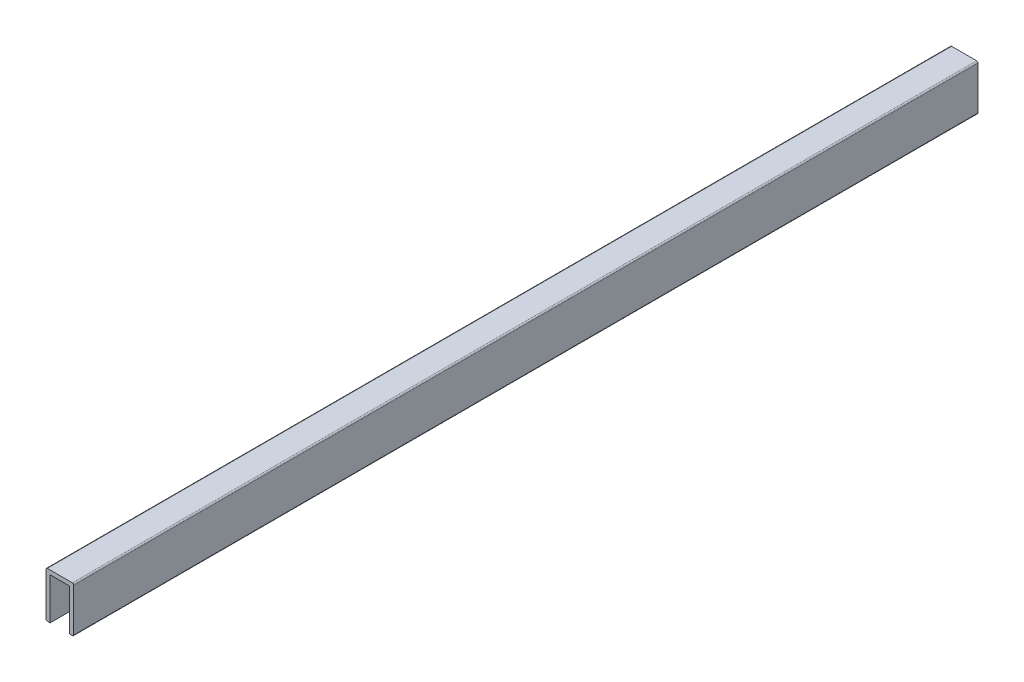
ISO-10303-21;
HEADER;
FILE_DESCRIPTION(('STEP AP214'),'2;1');
FILE_NAME('part.step','',(''),(''),'','','');
FILE_SCHEMA(('AUTOMOTIVE_DESIGN { 1 0 10303 214 1 1 1 1 }'));
ENDSEC;
DATA;
#1=APPLICATION_CONTEXT('core data for automotive mechanical design processes');
#2=APPLICATION_PROTOCOL_DEFINITION('international standard','automotive_design',2000,#1);
#3=PRODUCT_CONTEXT('',#1,'mechanical');
#4=PRODUCT('Part','Part','',(#3));
#5=PRODUCT_RELATED_PRODUCT_CATEGORY('part','',(#4));
#6=PRODUCT_DEFINITION_FORMATION('','',#4);
#7=PRODUCT_DEFINITION_CONTEXT('part definition',#1,'design');
#8=PRODUCT_DEFINITION('design','',#6,#7);
#9=PRODUCT_DEFINITION_SHAPE('','',#8);
#10=(LENGTH_UNIT() NAMED_UNIT(*) SI_UNIT(.MILLI.,.METRE.));
#11=(NAMED_UNIT(*) PLANE_ANGLE_UNIT() SI_UNIT($,.RADIAN.));
#12=(NAMED_UNIT(*) SI_UNIT($,.STERADIAN.) SOLID_ANGLE_UNIT());
#13=UNCERTAINTY_MEASURE_WITH_UNIT(LENGTH_MEASURE(1.E-05),#10,'distance_accuracy_value','');
#14=(GEOMETRIC_REPRESENTATION_CONTEXT(3) GLOBAL_UNCERTAINTY_ASSIGNED_CONTEXT((#13)) GLOBAL_UNIT_ASSIGNED_CONTEXT((#10,
#11,#12)) REPRESENTATION_CONTEXT('',''));
#15=CARTESIAN_POINT('',(0.,0.,0.));
#16=DIRECTION('',(0.,0.,1.));
#17=DIRECTION('',(1.,0.,0.));
#18=AXIS2_PLACEMENT_3D('',#15,#16,#17);
#19=CARTESIAN_POINT('',(3.5,-7.5,326.));
#20=DIRECTION('',(1.,0.,0.));
#21=DIRECTION('',(0.,0.,-1.));
#22=AXIS2_PLACEMENT_3D('',#19,#20,#21);
#23=PLANE('',#22);
#24=DIRECTION('',(0.,-1.,0.));
#25=VECTOR('',#24,1.);
#26=CARTESIAN_POINT('',(3.5,-7.5,0.));
#27=LINE('',#26,#25);
#28=CARTESIAN_POINT('',(3.5,7.5,0.));
#29=VERTEX_POINT('',#28);
#30=CARTESIAN_POINT('',(3.5,-7.5,0.));
#31=VERTEX_POINT('',#30);
#32=EDGE_CURVE('E159',#29,#31,#27,.T.);
#33=ORIENTED_EDGE('',*,*,#32,.T.);
#34=DIRECTION('',(0.,0.,-1.));
#35=VECTOR('',#34,1.);
#36=CARTESIAN_POINT('',(3.5,-7.5,326.));
#37=LINE('',#36,#35);
#38=CARTESIAN_POINT('',(3.5,-7.5,326.));
#39=VERTEX_POINT('',#38);
#40=EDGE_CURVE('E139',#39,#31,#37,.T.);
#41=ORIENTED_EDGE('',*,*,#40,.F.);
#42=DIRECTION('',(0.,-1.,0.));
#43=VECTOR('',#42,1.);
#44=CARTESIAN_POINT('',(3.5,-7.5,326.));
#45=LINE('',#44,#43);
#46=CARTESIAN_POINT('',(3.5,7.5,326.));
#47=VERTEX_POINT('',#46);
#48=EDGE_CURVE('E146',#47,#39,#45,.T.);
#49=ORIENTED_EDGE('',*,*,#48,.F.);
#50=DIRECTION('',(0.,0.,-1.));
#51=VECTOR('',#50,1.);
#52=CARTESIAN_POINT('',(3.5,7.5,326.));
#53=LINE('',#52,#51);
#54=EDGE_CURVE('E248',#47,#29,#53,.T.);
#55=ORIENTED_EDGE('',*,*,#54,.T.);
#56=EDGE_LOOP('',(#33,#41,#49,#55));
#57=FACE_BOUND('',#56,.T.);
#58=ADVANCED_FACE('F43',(#57),#23,.F.);
#59=CARTESIAN_POINT('',(3.5,-7.5,326.));
#60=DIRECTION('',(0.,1.,0.));
#61=DIRECTION('',(0.,0.,1.));
#62=AXIS2_PLACEMENT_3D('',#59,#60,#61);
#63=PLANE('',#62);
#64=DIRECTION('',(1.,0.,0.));
#65=VECTOR('',#64,1.);
#66=CARTESIAN_POINT('',(3.5,-7.5,0.));
#67=LINE('',#66,#65);
#68=CARTESIAN_POINT('',(4.5,-7.5,0.));
#69=VERTEX_POINT('',#68);
#70=EDGE_CURVE('E237',#31,#69,#67,.T.);
#71=ORIENTED_EDGE('',*,*,#70,.T.);
#72=DIRECTION('',(0.,0.,-1.));
#73=VECTOR('',#72,1.);
#74=CARTESIAN_POINT('',(4.5,-7.5,326.));
#75=LINE('',#74,#73);
#76=CARTESIAN_POINT('',(4.5,-7.5,326.));
#77=VERTEX_POINT('',#76);
#78=EDGE_CURVE('E142',#69,#77,#75,.F.);
#79=ORIENTED_EDGE('',*,*,#78,.T.);
#80=DIRECTION('',(1.,0.,0.));
#81=VECTOR('',#80,1.);
#82=CARTESIAN_POINT('',(3.5,-7.5,326.));
#83=LINE('',#82,#81);
#84=EDGE_CURVE('E134',#39,#77,#83,.T.);
#85=ORIENTED_EDGE('',*,*,#84,.F.);
#86=ORIENTED_EDGE('',*,*,#40,.T.);
#87=EDGE_LOOP('',(#71,#79,#85,#86));
#88=FACE_BOUND('',#87,.T.);
#89=ADVANCED_FACE('F137',(#88),#63,.F.);
#90=CARTESIAN_POINT('',(5.,-7.5,326.));
#91=DIRECTION('',(-1.,0.,0.));
#92=DIRECTION('',(0.,0.,1.));
#93=AXIS2_PLACEMENT_3D('',#90,#91,#92);
#94=PLANE('',#93);
#95=DIRECTION('',(0.,1.,0.));
#96=VECTOR('',#95,1.);
#97=CARTESIAN_POINT('',(5.,-7.5,326.));
#98=LINE('',#97,#96);
#99=CARTESIAN_POINT('',(5.,-7.,326.));
#100=VERTEX_POINT('',#99);
#101=CARTESIAN_POINT('',(5.,8.5,326.));
#102=VERTEX_POINT('',#101);
#103=EDGE_CURVE('E145',#100,#102,#98,.T.);
#104=ORIENTED_EDGE('',*,*,#103,.F.);
#105=DIRECTION('',(0.,0.,-1.));
#106=VECTOR('',#105,1.);
#107=CARTESIAN_POINT('',(5.,-7.,326.));
#108=LINE('',#107,#106);
#109=CARTESIAN_POINT('',(5.,-7.,0.));
#110=VERTEX_POINT('',#109);
#111=EDGE_CURVE('E166',#100,#110,#108,.T.);
#112=ORIENTED_EDGE('',*,*,#111,.T.);
#113=DIRECTION('',(0.,1.,0.));
#114=VECTOR('',#113,1.);
#115=CARTESIAN_POINT('',(5.,-7.5,0.));
#116=LINE('',#115,#114);
#117=CARTESIAN_POINT('',(5.,8.5,0.));
#118=VERTEX_POINT('',#117);
#119=EDGE_CURVE('E231',#110,#118,#116,.T.);
#120=ORIENTED_EDGE('',*,*,#119,.T.);
#121=DIRECTION('',(0.,0.,-1.));
#122=VECTOR('',#121,1.);
#123=CARTESIAN_POINT('',(5.,8.5,326.));
#124=LINE('',#123,#122);
#125=EDGE_CURVE('E161',#118,#102,#124,.F.);
#126=ORIENTED_EDGE('',*,*,#125,.T.);
#127=EDGE_LOOP('',(#104,#112,#120,#126));
#128=FACE_BOUND('',#127,.T.);
#129=ADVANCED_FACE('F283',(#128),#94,.F.);
#130=CARTESIAN_POINT('',(-5.,9.,326.));
#131=DIRECTION('',(0.,-1.,0.));
#132=DIRECTION('',(0.,0.,-1.));
#133=AXIS2_PLACEMENT_3D('',#130,#131,#132);
#134=PLANE('',#133);
#135=DIRECTION('',(-1.,0.,0.));
#136=VECTOR('',#135,1.);
#137=CARTESIAN_POINT('',(-5.,9.,0.));
#138=LINE('',#137,#136);
#139=CARTESIAN_POINT('',(4.5,9.,0.));
#140=VERTEX_POINT('',#139);
#141=CARTESIAN_POINT('',(-4.5,9.,0.));
#142=VERTEX_POINT('',#141);
#143=EDGE_CURVE('E218',#140,#142,#138,.T.);
#144=ORIENTED_EDGE('',*,*,#143,.T.);
#145=DIRECTION('',(0.,0.,-1.));
#146=VECTOR('',#145,1.);
#147=CARTESIAN_POINT('',(-4.5,9.,326.));
#148=LINE('',#147,#146);
#149=CARTESIAN_POINT('',(-4.5,9.,326.));
#150=VERTEX_POINT('',#149);
#151=EDGE_CURVE('E11',#142,#150,#148,.F.);
#152=ORIENTED_EDGE('',*,*,#151,.T.);
#153=DIRECTION('',(-1.,0.,0.));
#154=VECTOR('',#153,1.);
#155=CARTESIAN_POINT('',(-5.,9.,326.));
#156=LINE('',#155,#154);
#157=CARTESIAN_POINT('',(4.5,9.,326.));
#158=VERTEX_POINT('',#157);
#159=EDGE_CURVE('E221',#158,#150,#156,.T.);
#160=ORIENTED_EDGE('',*,*,#159,.F.);
#161=DIRECTION('',(0.,0.,-1.));
#162=VECTOR('',#161,1.);
#163=CARTESIAN_POINT('',(4.5,9.,326.));
#164=LINE('',#163,#162);
#165=EDGE_CURVE('E52',#158,#140,#164,.T.);
#166=ORIENTED_EDGE('',*,*,#165,.T.);
#167=EDGE_LOOP('',(#144,#152,#160,#166));
#168=FACE_BOUND('',#167,.T.);
#169=ADVANCED_FACE('F217',(#168),#134,.F.);
#170=CARTESIAN_POINT('',(-5.,-7.5,326.));
#171=DIRECTION('',(1.,0.,0.));
#172=DIRECTION('',(0.,0.,-1.));
#173=AXIS2_PLACEMENT_3D('',#170,#171,#172);
#174=PLANE('',#173);
#175=DIRECTION('',(0.,-1.,0.));
#176=VECTOR('',#175,1.);
#177=CARTESIAN_POINT('',(-5.,-7.5,0.));
#178=LINE('',#177,#176);
#179=CARTESIAN_POINT('',(-5.,8.5,0.));
#180=VERTEX_POINT('',#179);
#181=CARTESIAN_POINT('',(-5.,-7.,0.));
#182=VERTEX_POINT('',#181);
#183=EDGE_CURVE('E230',#180,#182,#178,.T.);
#184=ORIENTED_EDGE('',*,*,#183,.T.);
#185=DIRECTION('',(0.,0.,-1.));
#186=VECTOR('',#185,1.);
#187=CARTESIAN_POINT('',(-5.,-7.,326.));
#188=LINE('',#187,#186);
#189=CARTESIAN_POINT('',(-5.,-7.,326.));
#190=VERTEX_POINT('',#189);
#191=EDGE_CURVE('E67',#182,#190,#188,.F.);
#192=ORIENTED_EDGE('',*,*,#191,.T.);
#193=DIRECTION('',(0.,-1.,0.));
#194=VECTOR('',#193,1.);
#195=CARTESIAN_POINT('',(-5.,-7.5,326.));
#196=LINE('',#195,#194);
#197=CARTESIAN_POINT('',(-5.,8.5,326.));
#198=VERTEX_POINT('',#197);
#199=EDGE_CURVE('E272',#198,#190,#196,.T.);
#200=ORIENTED_EDGE('',*,*,#199,.F.);
#201=DIRECTION('',(0.,0.,-1.));
#202=VECTOR('',#201,1.);
#203=CARTESIAN_POINT('',(-5.,8.5,326.));
#204=LINE('',#203,#202);
#205=EDGE_CURVE('E205',#198,#180,#204,.T.);
#206=ORIENTED_EDGE('',*,*,#205,.T.);
#207=EDGE_LOOP('',(#184,#192,#200,#206));
#208=FACE_BOUND('',#207,.T.);
#209=ADVANCED_FACE('F308',(#208),#174,.F.);
#210=CARTESIAN_POINT('',(-3.5,-7.5,326.));
#211=DIRECTION('',(0.,1.,0.));
#212=DIRECTION('',(0.,0.,1.));
#213=AXIS2_PLACEMENT_3D('',#210,#211,#212);
#214=PLANE('',#213);
#215=DIRECTION('',(1.,0.,0.));
#216=VECTOR('',#215,1.);
#217=CARTESIAN_POINT('',(-3.5,-7.5,326.));
#218=LINE('',#217,#216);
#219=CARTESIAN_POINT('',(-4.5,-7.5,326.));
#220=VERTEX_POINT('',#219);
#221=CARTESIAN_POINT('',(-3.5,-7.5,326.));
#222=VERTEX_POINT('',#221);
#223=EDGE_CURVE('E269',#220,#222,#218,.T.);
#224=ORIENTED_EDGE('',*,*,#223,.F.);
#225=DIRECTION('',(0.,0.,-1.));
#226=VECTOR('',#225,1.);
#227=CARTESIAN_POINT('',(-4.5,-7.5,326.));
#228=LINE('',#227,#226);
#229=CARTESIAN_POINT('',(-4.5,-7.5,0.));
#230=VERTEX_POINT('',#229);
#231=EDGE_CURVE('E201',#220,#230,#228,.T.);
#232=ORIENTED_EDGE('',*,*,#231,.T.);
#233=DIRECTION('',(1.,0.,0.));
#234=VECTOR('',#233,1.);
#235=CARTESIAN_POINT('',(-3.5,-7.5,0.));
#236=LINE('',#235,#234);
#237=CARTESIAN_POINT('',(-3.5,-7.5,0.));
#238=VERTEX_POINT('',#237);
#239=EDGE_CURVE('E235',#230,#238,#236,.T.);
#240=ORIENTED_EDGE('',*,*,#239,.T.);
#241=DIRECTION('',(0.,0.,-1.));
#242=VECTOR('',#241,1.);
#243=CARTESIAN_POINT('',(-3.5,-7.5,326.));
#244=LINE('',#243,#242);
#245=EDGE_CURVE('E162',#222,#238,#244,.T.);
#246=ORIENTED_EDGE('',*,*,#245,.F.);
#247=EDGE_LOOP('',(#224,#232,#240,#246));
#248=FACE_BOUND('',#247,.T.);
#249=ADVANCED_FACE('F311',(#248),#214,.F.);
#250=CARTESIAN_POINT('',(-3.5,-7.5,326.));
#251=DIRECTION('',(-1.,0.,0.));
#252=DIRECTION('',(0.,0.,1.));
#253=AXIS2_PLACEMENT_3D('',#250,#251,#252);
#254=PLANE('',#253);
#255=DIRECTION('',(0.,1.,0.));
#256=VECTOR('',#255,1.);
#257=CARTESIAN_POINT('',(-3.5,-7.5,0.));
#258=LINE('',#257,#256);
#259=CARTESIAN_POINT('',(-3.5,7.5,0.));
#260=VERTEX_POINT('',#259);
#261=EDGE_CURVE('E243',#238,#260,#258,.T.);
#262=ORIENTED_EDGE('',*,*,#261,.T.);
#263=DIRECTION('',(0.,0.,-1.));
#264=VECTOR('',#263,1.);
#265=CARTESIAN_POINT('',(-3.5,7.5,326.));
#266=LINE('',#265,#264);
#267=CARTESIAN_POINT('',(-3.5,7.5,326.));
#268=VERTEX_POINT('',#267);
#269=EDGE_CURVE('E169',#268,#260,#266,.T.);
#270=ORIENTED_EDGE('',*,*,#269,.F.);
#271=DIRECTION('',(0.,1.,0.));
#272=VECTOR('',#271,1.);
#273=CARTESIAN_POINT('',(-3.5,-7.5,326.));
#274=LINE('',#273,#272);
#275=EDGE_CURVE('E266',#222,#268,#274,.T.);
#276=ORIENTED_EDGE('',*,*,#275,.F.);
#277=ORIENTED_EDGE('',*,*,#245,.T.);
#278=EDGE_LOOP('',(#262,#270,#276,#277));
#279=FACE_BOUND('',#278,.T.);
#280=ADVANCED_FACE('F314',(#279),#254,.F.);
#281=CARTESIAN_POINT('',(-3.5,7.5,326.));
#282=DIRECTION('',(0.,1.,0.));
#283=DIRECTION('',(0.,0.,1.));
#284=AXIS2_PLACEMENT_3D('',#281,#282,#283);
#285=PLANE('',#284);
#286=DIRECTION('',(1.,0.,0.));
#287=VECTOR('',#286,1.);
#288=CARTESIAN_POINT('',(-3.5,7.5,0.));
#289=LINE('',#288,#287);
#290=EDGE_CURVE('E156',#260,#29,#289,.T.);
#291=ORIENTED_EDGE('',*,*,#290,.T.);
#292=ORIENTED_EDGE('',*,*,#54,.F.);
#293=DIRECTION('',(1.,0.,0.));
#294=VECTOR('',#293,1.);
#295=CARTESIAN_POINT('',(-3.5,7.5,326.));
#296=LINE('',#295,#294);
#297=EDGE_CURVE('E151',#268,#47,#296,.T.);
#298=ORIENTED_EDGE('',*,*,#297,.F.);
#299=ORIENTED_EDGE('',*,*,#269,.T.);
#300=EDGE_LOOP('',(#291,#292,#298,#299));
#301=FACE_BOUND('',#300,.T.);
#302=ADVANCED_FACE('F255',(#301),#285,.F.);
#303=CARTESIAN_POINT('',(0.,0.,326.));
#304=DIRECTION('',(0.,0.,-1.));
#305=DIRECTION('',(-1.,0.,0.));
#306=AXIS2_PLACEMENT_3D('',#303,#304,#305);
#307=PLANE('',#306);
#308=ORIENTED_EDGE('',*,*,#84,.T.);
#309=CARTESIAN_POINT('',(4.5,-7.,326.));
#310=DIRECTION('',(0.,0.,-1.));
#311=DIRECTION('',(-1.,0.,0.));
#312=AXIS2_PLACEMENT_3D('',#309,#310,#311);
#313=CIRCLE('',#312,0.5);
#314=EDGE_CURVE('E198',#77,#100,#313,.F.);
#315=ORIENTED_EDGE('',*,*,#314,.T.);
#316=ORIENTED_EDGE('',*,*,#103,.T.);
#317=CARTESIAN_POINT('',(4.5,8.5,326.));
#318=DIRECTION('',(0.,0.,-1.));
#319=DIRECTION('',(-1.,0.,0.));
#320=AXIS2_PLACEMENT_3D('',#317,#318,#319);
#321=CIRCLE('',#320,0.5);
#322=EDGE_CURVE('E190',#102,#158,#321,.F.);
#323=ORIENTED_EDGE('',*,*,#322,.T.);
#324=ORIENTED_EDGE('',*,*,#159,.T.);
#325=CARTESIAN_POINT('',(-4.5,8.5,326.));
#326=DIRECTION('',(0.,0.,-1.));
#327=DIRECTION('',(-1.,0.,0.));
#328=AXIS2_PLACEMENT_3D('',#325,#326,#327);
#329=CIRCLE('',#328,0.5);
#330=EDGE_CURVE('E193',#150,#198,#329,.F.);
#331=ORIENTED_EDGE('',*,*,#330,.T.);
#332=ORIENTED_EDGE('',*,*,#199,.T.);
#333=CARTESIAN_POINT('',(-4.5,-7.,326.));
#334=DIRECTION('',(0.,0.,-1.));
#335=DIRECTION('',(-1.,0.,0.));
#336=AXIS2_PLACEMENT_3D('',#333,#334,#335);
#337=CIRCLE('',#336,0.5);
#338=EDGE_CURVE('E59',#190,#220,#337,.F.);
#339=ORIENTED_EDGE('',*,*,#338,.T.);
#340=ORIENTED_EDGE('',*,*,#223,.T.);
#341=ORIENTED_EDGE('',*,*,#275,.T.);
#342=ORIENTED_EDGE('',*,*,#297,.T.);
#343=ORIENTED_EDGE('',*,*,#48,.T.);
#344=EDGE_LOOP('',(#308,#315,#316,#323,#324,#331,#332,#339,#340,#341,#342,#343));
#345=FACE_BOUND('',#344,.T.);
#346=ADVANCED_FACE('F149',(#345),#307,.F.);
#347=CARTESIAN_POINT('',(0.,0.,0.));
#348=DIRECTION('',(0.,0.,-1.));
#349=DIRECTION('',(-1.,0.,0.));
#350=AXIS2_PLACEMENT_3D('',#347,#348,#349);
#351=PLANE('',#350);
#352=ORIENTED_EDGE('',*,*,#119,.F.);
#353=CARTESIAN_POINT('',(4.5,-7.,0.));
#354=DIRECTION('',(0.,0.,-1.));
#355=DIRECTION('',(-1.,0.,0.));
#356=AXIS2_PLACEMENT_3D('',#353,#354,#355);
#357=CIRCLE('',#356,0.5);
#358=EDGE_CURVE('E185',#110,#69,#357,.T.);
#359=ORIENTED_EDGE('',*,*,#358,.T.);
#360=ORIENTED_EDGE('',*,*,#70,.F.);
#361=ORIENTED_EDGE('',*,*,#32,.F.);
#362=ORIENTED_EDGE('',*,*,#290,.F.);
#363=ORIENTED_EDGE('',*,*,#261,.F.);
#364=ORIENTED_EDGE('',*,*,#239,.F.);
#365=CARTESIAN_POINT('',(-4.5,-7.,0.));
#366=DIRECTION('',(0.,0.,-1.));
#367=DIRECTION('',(-1.,0.,0.));
#368=AXIS2_PLACEMENT_3D('',#365,#366,#367);
#369=CIRCLE('',#368,0.5);
#370=EDGE_CURVE('E182',#230,#182,#369,.T.);
#371=ORIENTED_EDGE('',*,*,#370,.T.);
#372=ORIENTED_EDGE('',*,*,#183,.F.);
#373=CARTESIAN_POINT('',(-4.5,8.5,0.));
#374=DIRECTION('',(0.,0.,-1.));
#375=DIRECTION('',(-1.,0.,0.));
#376=AXIS2_PLACEMENT_3D('',#373,#374,#375);
#377=CIRCLE('',#376,0.5);
#378=EDGE_CURVE('E179',#180,#142,#377,.T.);
#379=ORIENTED_EDGE('',*,*,#378,.T.);
#380=ORIENTED_EDGE('',*,*,#143,.F.);
#381=CARTESIAN_POINT('',(4.5,8.5,0.));
#382=DIRECTION('',(0.,0.,-1.));
#383=DIRECTION('',(-1.,0.,0.));
#384=AXIS2_PLACEMENT_3D('',#381,#382,#383);
#385=CIRCLE('',#384,0.5);
#386=EDGE_CURVE('E176',#140,#118,#385,.T.);
#387=ORIENTED_EDGE('',*,*,#386,.T.);
#388=EDGE_LOOP('',(#352,#359,#360,#361,#362,#363,#364,#371,#372,#379,#380,#387));
#389=FACE_BOUND('',#388,.T.);
#390=ADVANCED_FACE('F226',(#389),#351,.T.);
#391=CARTESIAN_POINT('',(4.5,-7.,326.));
#392=DIRECTION('',(0.,0.,-1.));
#393=DIRECTION('',(-1.,0.,0.));
#394=AXIS2_PLACEMENT_3D('',#391,#392,#393);
#395=CYLINDRICAL_SURFACE('',#394,0.5);
#396=ORIENTED_EDGE('',*,*,#314,.F.);
#397=ORIENTED_EDGE('',*,*,#78,.F.);
#398=ORIENTED_EDGE('',*,*,#358,.F.);
#399=ORIENTED_EDGE('',*,*,#111,.F.);
#400=EDGE_LOOP('',(#396,#397,#398,#399));
#401=FACE_BOUND('',#400,.T.);
#402=ADVANCED_FACE('F285',(#401),#395,.T.);
#403=CARTESIAN_POINT('',(-4.5,-7.,326.));
#404=DIRECTION('',(0.,0.,-1.));
#405=DIRECTION('',(-1.,0.,0.));
#406=AXIS2_PLACEMENT_3D('',#403,#404,#405);
#407=CYLINDRICAL_SURFACE('',#406,0.5);
#408=ORIENTED_EDGE('',*,*,#338,.F.);
#409=ORIENTED_EDGE('',*,*,#191,.F.);
#410=ORIENTED_EDGE('',*,*,#370,.F.);
#411=ORIENTED_EDGE('',*,*,#231,.F.);
#412=EDGE_LOOP('',(#408,#409,#410,#411));
#413=FACE_BOUND('',#412,.T.);
#414=ADVANCED_FACE('F287',(#413),#407,.T.);
#415=CARTESIAN_POINT('',(-4.5,8.5,326.));
#416=DIRECTION('',(0.,0.,-1.));
#417=DIRECTION('',(-1.,0.,0.));
#418=AXIS2_PLACEMENT_3D('',#415,#416,#417);
#419=CYLINDRICAL_SURFACE('',#418,0.5);
#420=ORIENTED_EDGE('',*,*,#330,.F.);
#421=ORIENTED_EDGE('',*,*,#151,.F.);
#422=ORIENTED_EDGE('',*,*,#378,.F.);
#423=ORIENTED_EDGE('',*,*,#205,.F.);
#424=EDGE_LOOP('',(#420,#421,#422,#423));
#425=FACE_BOUND('',#424,.T.);
#426=ADVANCED_FACE('F293',(#425),#419,.T.);
#427=CARTESIAN_POINT('',(4.5,8.5,326.));
#428=DIRECTION('',(0.,0.,-1.));
#429=DIRECTION('',(-1.,0.,0.));
#430=AXIS2_PLACEMENT_3D('',#427,#428,#429);
#431=CYLINDRICAL_SURFACE('',#430,0.5);
#432=ORIENTED_EDGE('',*,*,#322,.F.);
#433=ORIENTED_EDGE('',*,*,#125,.F.);
#434=ORIENTED_EDGE('',*,*,#386,.F.);
#435=ORIENTED_EDGE('',*,*,#165,.F.);
#436=EDGE_LOOP('',(#432,#433,#434,#435));
#437=FACE_BOUND('',#436,.T.);
#438=ADVANCED_FACE('F45',(#437),#431,.T.);
#439=CLOSED_SHELL('',(#58,#89,#129,#169,#209,#249,#280,#302,#346,#390,#402,#414,#426,#438));
#440=MANIFOLD_SOLID_BREP('B2',#439);
#441=ADVANCED_BREP_SHAPE_REPRESENTATION('',(#18,#440),#14);
#442=SHAPE_DEFINITION_REPRESENTATION(#9,#441);
ENDSEC;
END-ISO-10303-21;
